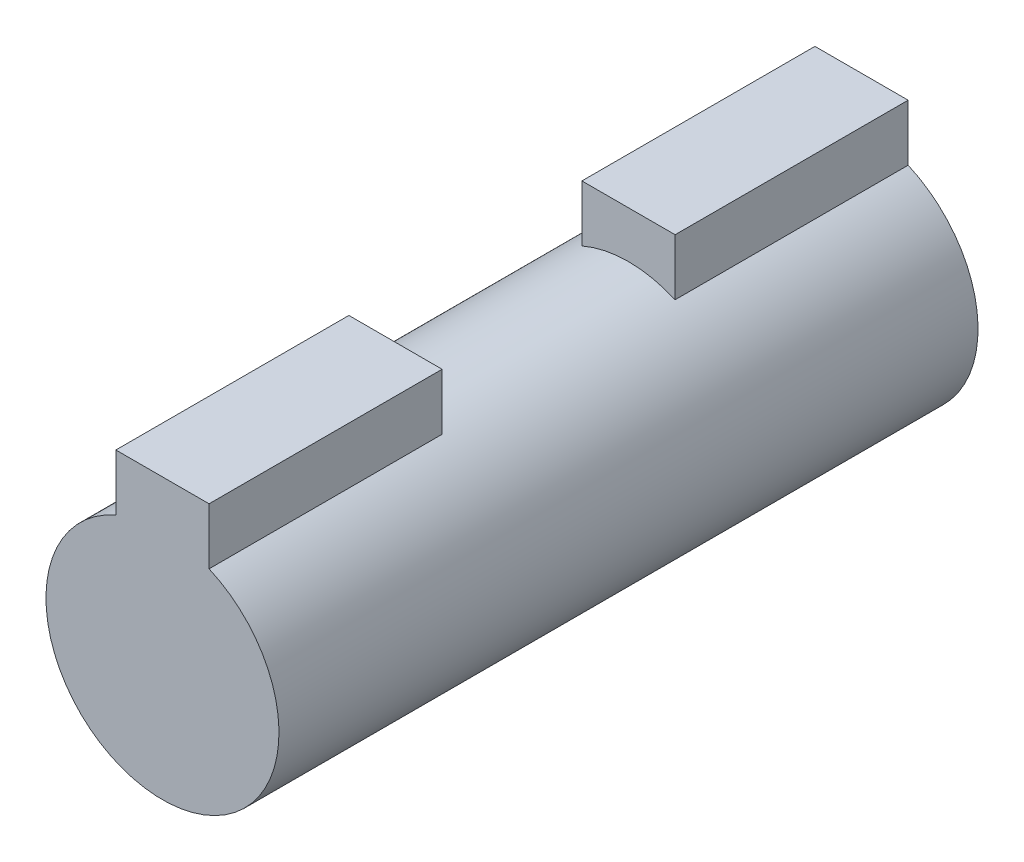
ISO-10303-21;
HEADER;
FILE_DESCRIPTION(('STEP AP214'),'2;1');
FILE_NAME('part.step','',(''),(''),'','','');
FILE_SCHEMA(('AUTOMOTIVE_DESIGN { 1 0 10303 214 1 1 1 1 }'));
ENDSEC;
DATA;
#1=APPLICATION_CONTEXT('core data for automotive mechanical design processes');
#2=APPLICATION_PROTOCOL_DEFINITION('international standard','automotive_design',2000,#1);
#3=PRODUCT_CONTEXT('',#1,'mechanical');
#4=PRODUCT('Part','Part','',(#3));
#5=PRODUCT_RELATED_PRODUCT_CATEGORY('part','',(#4));
#6=PRODUCT_DEFINITION_FORMATION('','',#4);
#7=PRODUCT_DEFINITION_CONTEXT('part definition',#1,'design');
#8=PRODUCT_DEFINITION('design','',#6,#7);
#9=PRODUCT_DEFINITION_SHAPE('','',#8);
#10=(LENGTH_UNIT() NAMED_UNIT(*) SI_UNIT(.MILLI.,.METRE.));
#11=(NAMED_UNIT(*) PLANE_ANGLE_UNIT() SI_UNIT($,.RADIAN.));
#12=(NAMED_UNIT(*) SI_UNIT($,.STERADIAN.) SOLID_ANGLE_UNIT());
#13=UNCERTAINTY_MEASURE_WITH_UNIT(LENGTH_MEASURE(1.E-05),#10,'distance_accuracy_value','');
#14=(GEOMETRIC_REPRESENTATION_CONTEXT(3) GLOBAL_UNCERTAINTY_ASSIGNED_CONTEXT((#13)) GLOBAL_UNIT_ASSIGNED_CONTEXT((#10,
#11,#12)) REPRESENTATION_CONTEXT('',''));
#15=CARTESIAN_POINT('',(0.,0.,0.));
#16=DIRECTION('',(0.,0.,1.));
#17=DIRECTION('',(1.,0.,0.));
#18=AXIS2_PLACEMENT_3D('',#15,#16,#17);
#19=CARTESIAN_POINT('',(-2.,0.,30.));
#20=DIRECTION('',(1.,0.,0.));
#21=DIRECTION('',(0.,0.,-1.));
#22=AXIS2_PLACEMENT_3D('',#19,#20,#21);
#23=PLANE('',#22);
#24=DIRECTION('',(0.,-1.,0.));
#25=VECTOR('',#24,1.);
#26=CARTESIAN_POINT('',(-2.,0.,9.99999999999999));
#27=LINE('',#26,#25);
#28=CARTESIAN_POINT('',(-2.,7.,9.99999999999999));
#29=VERTEX_POINT('',#28);
#30=CARTESIAN_POINT('',(-2.,4.58257569495584,10.));
#31=VERTEX_POINT('',#30);
#32=EDGE_CURVE('E178',#29,#31,#27,.T.);
#33=ORIENTED_EDGE('',*,*,#32,.F.);
#34=DIRECTION('',(0.,0.,-1.));
#35=VECTOR('',#34,1.);
#36=CARTESIAN_POINT('',(-2.,7.,30.));
#37=LINE('',#36,#35);
#38=CARTESIAN_POINT('',(-2.,7.,0.));
#39=VERTEX_POINT('',#38);
#40=EDGE_CURVE('E92',#29,#39,#37,.T.);
#41=ORIENTED_EDGE('',*,*,#40,.T.);
#42=DIRECTION('',(0.,-1.,0.));
#43=VECTOR('',#42,1.);
#44=CARTESIAN_POINT('',(-2.,0.,0.));
#45=LINE('',#44,#43);
#46=CARTESIAN_POINT('',(-2.,4.58257569495584,0.));
#47=VERTEX_POINT('',#46);
#48=EDGE_CURVE('E176',#39,#47,#45,.T.);
#49=ORIENTED_EDGE('',*,*,#48,.T.);
#50=DIRECTION('',(0.,0.,-1.));
#51=VECTOR('',#50,1.);
#52=CARTESIAN_POINT('',(-2.,4.58257569495584,30.));
#53=LINE('',#52,#51);
#54=EDGE_CURVE('E142',#31,#47,#53,.T.);
#55=ORIENTED_EDGE('',*,*,#54,.F.);
#56=EDGE_LOOP('',(#33,#41,#49,#55));
#57=FACE_BOUND('',#56,.T.);
#58=ADVANCED_FACE('F50',(#57),#23,.F.);
#59=CARTESIAN_POINT('',(2.,0.,30.));
#60=DIRECTION('',(1.,0.,0.));
#61=DIRECTION('',(0.,0.,-1.));
#62=AXIS2_PLACEMENT_3D('',#59,#60,#61);
#63=PLANE('',#62);
#64=DIRECTION('',(0.,0.,-1.));
#65=VECTOR('',#64,1.);
#66=CARTESIAN_POINT('',(2.,7.,30.));
#67=LINE('',#66,#65);
#68=CARTESIAN_POINT('',(2.,7.,9.99999999999999));
#69=VERTEX_POINT('',#68);
#70=CARTESIAN_POINT('',(2.,7.,0.));
#71=VERTEX_POINT('',#70);
#72=EDGE_CURVE('E161',#69,#71,#67,.T.);
#73=ORIENTED_EDGE('',*,*,#72,.F.);
#74=DIRECTION('',(0.,-1.,0.));
#75=VECTOR('',#74,1.);
#76=CARTESIAN_POINT('',(2.,0.,9.99999999999999));
#77=LINE('',#76,#75);
#78=CARTESIAN_POINT('',(2.,4.58257569495584,10.));
#79=VERTEX_POINT('',#78);
#80=EDGE_CURVE('E187',#69,#79,#77,.T.);
#81=ORIENTED_EDGE('',*,*,#80,.T.);
#82=DIRECTION('',(0.,0.,-1.));
#83=VECTOR('',#82,1.);
#84=CARTESIAN_POINT('',(2.,4.58257569495584,30.));
#85=LINE('',#84,#83);
#86=CARTESIAN_POINT('',(2.,4.58257569495584,0.));
#87=VERTEX_POINT('',#86);
#88=EDGE_CURVE('E141',#79,#87,#85,.T.);
#89=ORIENTED_EDGE('',*,*,#88,.T.);
#90=DIRECTION('',(0.,-1.,0.));
#91=VECTOR('',#90,1.);
#92=CARTESIAN_POINT('',(2.,0.,0.));
#93=LINE('',#92,#91);
#94=EDGE_CURVE('E169',#71,#87,#93,.T.);
#95=ORIENTED_EDGE('',*,*,#94,.F.);
#96=EDGE_LOOP('',(#73,#81,#89,#95));
#97=FACE_BOUND('',#96,.T.);
#98=ADVANCED_FACE('F209',(#97),#63,.T.);
#99=CARTESIAN_POINT('',(0.,7.,30.));
#100=DIRECTION('',(0.,-1.,0.));
#101=DIRECTION('',(0.,0.,-1.));
#102=AXIS2_PLACEMENT_3D('',#99,#100,#101);
#103=PLANE('',#102);
#104=DIRECTION('',(-1.,0.,0.));
#105=VECTOR('',#104,1.);
#106=CARTESIAN_POINT('',(0.,7.,9.99999999999999));
#107=LINE('',#106,#105);
#108=EDGE_CURVE('E11',#69,#29,#107,.T.);
#109=ORIENTED_EDGE('',*,*,#108,.F.);
#110=ORIENTED_EDGE('',*,*,#72,.T.);
#111=DIRECTION('',(-1.,0.,0.));
#112=VECTOR('',#111,1.);
#113=CARTESIAN_POINT('',(0.,7.,0.));
#114=LINE('',#113,#112);
#115=EDGE_CURVE('E164',#71,#39,#114,.T.);
#116=ORIENTED_EDGE('',*,*,#115,.T.);
#117=ORIENTED_EDGE('',*,*,#40,.F.);
#118=EDGE_LOOP('',(#109,#110,#116,#117));
#119=FACE_BOUND('',#118,.T.);
#120=ADVANCED_FACE('F212',(#119),#103,.F.);
#121=CARTESIAN_POINT('',(-2.,7.,30.));
#122=VERTEX_POINT('',#121);
#123=CARTESIAN_POINT('',(-2.,7.,20.));
#124=VERTEX_POINT('',#123);
#125=EDGE_CURVE('E156',#122,#124,#37,.T.);
#126=ORIENTED_EDGE('',*,*,#125,.T.);
#127=DIRECTION('',(0.,-1.,0.));
#128=VECTOR('',#127,1.);
#129=CARTESIAN_POINT('',(-2.,0.,20.));
#130=LINE('',#129,#128);
#131=CARTESIAN_POINT('',(-2.,4.58257569495584,20.));
#132=VERTEX_POINT('',#131);
#133=EDGE_CURVE('E65',#124,#132,#130,.T.);
#134=ORIENTED_EDGE('',*,*,#133,.T.);
#135=CARTESIAN_POINT('',(-2.,4.58257569495584,30.));
#136=VERTEX_POINT('',#135);
#137=EDGE_CURVE('E136',#136,#132,#53,.T.);
#138=ORIENTED_EDGE('',*,*,#137,.F.);
#139=DIRECTION('',(0.,-1.,0.));
#140=VECTOR('',#139,1.);
#141=CARTESIAN_POINT('',(-2.,0.,30.));
#142=LINE('',#141,#140);
#143=EDGE_CURVE('E157',#122,#136,#142,.T.);
#144=ORIENTED_EDGE('',*,*,#143,.F.);
#145=EDGE_LOOP('',(#126,#134,#138,#144));
#146=FACE_BOUND('',#145,.T.);
#147=ADVANCED_FACE('F47',(#146),#23,.F.);
#148=CARTESIAN_POINT('',(0.,0.,30.));
#149=DIRECTION('',(0.,0.,-1.));
#150=DIRECTION('',(-1.,0.,0.));
#151=AXIS2_PLACEMENT_3D('',#148,#149,#150);
#152=CYLINDRICAL_SURFACE('',#151,5.);
#153=ORIENTED_EDGE('',*,*,#88,.F.);
#154=CARTESIAN_POINT('',(0.,0.,10.));
#155=DIRECTION('',(0.,0.,1.));
#156=DIRECTION('',(1.,0.,0.));
#157=AXIS2_PLACEMENT_3D('',#154,#155,#156);
#158=CIRCLE('',#157,5.);
#159=EDGE_CURVE('E128',#79,#31,#158,.T.);
#160=ORIENTED_EDGE('',*,*,#159,.T.);
#161=ORIENTED_EDGE('',*,*,#54,.T.);
#162=CARTESIAN_POINT('',(0.,0.,0.));
#163=DIRECTION('',(0.,0.,1.));
#164=DIRECTION('',(1.,0.,0.));
#165=AXIS2_PLACEMENT_3D('',#162,#163,#164);
#166=CIRCLE('',#165,5.);
#167=EDGE_CURVE('E171',#47,#87,#166,.T.);
#168=ORIENTED_EDGE('',*,*,#167,.T.);
#169=EDGE_LOOP('',(#153,#160,#161,#168));
#170=FACE_BOUND('',#169,.T.);
#171=ORIENTED_EDGE('',*,*,#137,.T.);
#172=CARTESIAN_POINT('',(0.,0.,20.));
#173=DIRECTION('',(0.,0.,1.));
#174=DIRECTION('',(1.,0.,0.));
#175=AXIS2_PLACEMENT_3D('',#172,#173,#174);
#176=CIRCLE('',#175,5.);
#177=CARTESIAN_POINT('',(2.,4.58257569495584,20.));
#178=VERTEX_POINT('',#177);
#179=EDGE_CURVE('E124',#178,#132,#176,.T.);
#180=ORIENTED_EDGE('',*,*,#179,.F.);
#181=CARTESIAN_POINT('',(2.,4.58257569495584,30.));
#182=VERTEX_POINT('',#181);
#183=EDGE_CURVE('E135',#182,#178,#85,.T.);
#184=ORIENTED_EDGE('',*,*,#183,.F.);
#185=CARTESIAN_POINT('',(0.,0.,30.));
#186=DIRECTION('',(0.,0.,1.));
#187=DIRECTION('',(1.,0.,0.));
#188=AXIS2_PLACEMENT_3D('',#185,#186,#187);
#189=CIRCLE('',#188,5.);
#190=EDGE_CURVE('E103',#136,#182,#189,.T.);
#191=ORIENTED_EDGE('',*,*,#190,.F.);
#192=EDGE_LOOP('',(#171,#180,#184,#191));
#193=FACE_BOUND('',#192,.T.);
#194=ADVANCED_FACE('F131',(#170,#193),#152,.T.);
#195=DIRECTION('',(0.,-1.,0.));
#196=VECTOR('',#195,1.);
#197=CARTESIAN_POINT('',(2.,0.,20.));
#198=LINE('',#197,#196);
#199=CARTESIAN_POINT('',(2.,7.,20.));
#200=VERTEX_POINT('',#199);
#201=EDGE_CURVE('E125',#200,#178,#198,.T.);
#202=ORIENTED_EDGE('',*,*,#201,.F.);
#203=CARTESIAN_POINT('',(2.,7.,30.));
#204=VERTEX_POINT('',#203);
#205=EDGE_CURVE('E146',#204,#200,#67,.T.);
#206=ORIENTED_EDGE('',*,*,#205,.F.);
#207=DIRECTION('',(0.,-1.,0.));
#208=VECTOR('',#207,1.);
#209=CARTESIAN_POINT('',(2.,0.,30.));
#210=LINE('',#209,#208);
#211=EDGE_CURVE('E139',#204,#182,#210,.T.);
#212=ORIENTED_EDGE('',*,*,#211,.T.);
#213=ORIENTED_EDGE('',*,*,#183,.T.);
#214=EDGE_LOOP('',(#202,#206,#212,#213));
#215=FACE_BOUND('',#214,.T.);
#216=ADVANCED_FACE('F138',(#215),#63,.T.);
#217=ORIENTED_EDGE('',*,*,#205,.T.);
#218=DIRECTION('',(-1.,0.,0.));
#219=VECTOR('',#218,1.);
#220=CARTESIAN_POINT('',(0.,7.,20.));
#221=LINE('',#220,#219);
#222=EDGE_CURVE('E57',#200,#124,#221,.T.);
#223=ORIENTED_EDGE('',*,*,#222,.T.);
#224=ORIENTED_EDGE('',*,*,#125,.F.);
#225=DIRECTION('',(-1.,0.,0.));
#226=VECTOR('',#225,1.);
#227=CARTESIAN_POINT('',(0.,7.,30.));
#228=LINE('',#227,#226);
#229=EDGE_CURVE('E75',#204,#122,#228,.T.);
#230=ORIENTED_EDGE('',*,*,#229,.F.);
#231=EDGE_LOOP('',(#217,#223,#224,#230));
#232=FACE_BOUND('',#231,.T.);
#233=ADVANCED_FACE('F154',(#232),#103,.F.);
#234=CARTESIAN_POINT('',(0.,0.,30.));
#235=DIRECTION('',(0.,0.,1.));
#236=DIRECTION('',(1.,0.,0.));
#237=AXIS2_PLACEMENT_3D('',#234,#235,#236);
#238=PLANE('',#237);
#239=ORIENTED_EDGE('',*,*,#143,.T.);
#240=ORIENTED_EDGE('',*,*,#190,.T.);
#241=ORIENTED_EDGE('',*,*,#211,.F.);
#242=ORIENTED_EDGE('',*,*,#229,.T.);
#243=EDGE_LOOP('',(#239,#240,#241,#242));
#244=FACE_BOUND('',#243,.T.);
#245=ADVANCED_FACE('F221',(#244),#238,.T.);
#246=CARTESIAN_POINT('',(0.,0.,0.));
#247=DIRECTION('',(0.,0.,1.));
#248=DIRECTION('',(1.,0.,0.));
#249=AXIS2_PLACEMENT_3D('',#246,#247,#248);
#250=PLANE('',#249);
#251=ORIENTED_EDGE('',*,*,#48,.F.);
#252=ORIENTED_EDGE('',*,*,#115,.F.);
#253=ORIENTED_EDGE('',*,*,#94,.T.);
#254=ORIENTED_EDGE('',*,*,#167,.F.);
#255=EDGE_LOOP('',(#251,#252,#253,#254));
#256=FACE_BOUND('',#255,.T.);
#257=ADVANCED_FACE('F206',(#256),#250,.F.);
#258=CARTESIAN_POINT('',(0.,0.,10.));
#259=DIRECTION('',(0.,0.,1.));
#260=DIRECTION('',(1.,0.,0.));
#261=AXIS2_PLACEMENT_3D('',#258,#259,#260);
#262=PLANE('',#261);
#263=ORIENTED_EDGE('',*,*,#32,.T.);
#264=ORIENTED_EDGE('',*,*,#159,.F.);
#265=ORIENTED_EDGE('',*,*,#80,.F.);
#266=ORIENTED_EDGE('',*,*,#108,.T.);
#267=EDGE_LOOP('',(#263,#264,#265,#266));
#268=FACE_BOUND('',#267,.T.);
#269=ADVANCED_FACE('F215',(#268),#262,.T.);
#270=CARTESIAN_POINT('',(0.,0.,20.));
#271=DIRECTION('',(0.,0.,1.));
#272=DIRECTION('',(1.,0.,0.));
#273=AXIS2_PLACEMENT_3D('',#270,#271,#272);
#274=PLANE('',#273);
#275=ORIENTED_EDGE('',*,*,#222,.F.);
#276=ORIENTED_EDGE('',*,*,#201,.T.);
#277=ORIENTED_EDGE('',*,*,#179,.T.);
#278=ORIENTED_EDGE('',*,*,#133,.F.);
#279=EDGE_LOOP('',(#275,#276,#277,#278));
#280=FACE_BOUND('',#279,.T.);
#281=ADVANCED_FACE('F123',(#280),#274,.F.);
#282=CLOSED_SHELL('',(#58,#98,#120,#147,#194,#216,#233,#245,#257,#269,#281));
#283=MANIFOLD_SOLID_BREP('B2',#282);
#284=ADVANCED_BREP_SHAPE_REPRESENTATION('',(#18,#283),#14);
#285=SHAPE_DEFINITION_REPRESENTATION(#9,#284);
ENDSEC;
END-ISO-10303-21;
